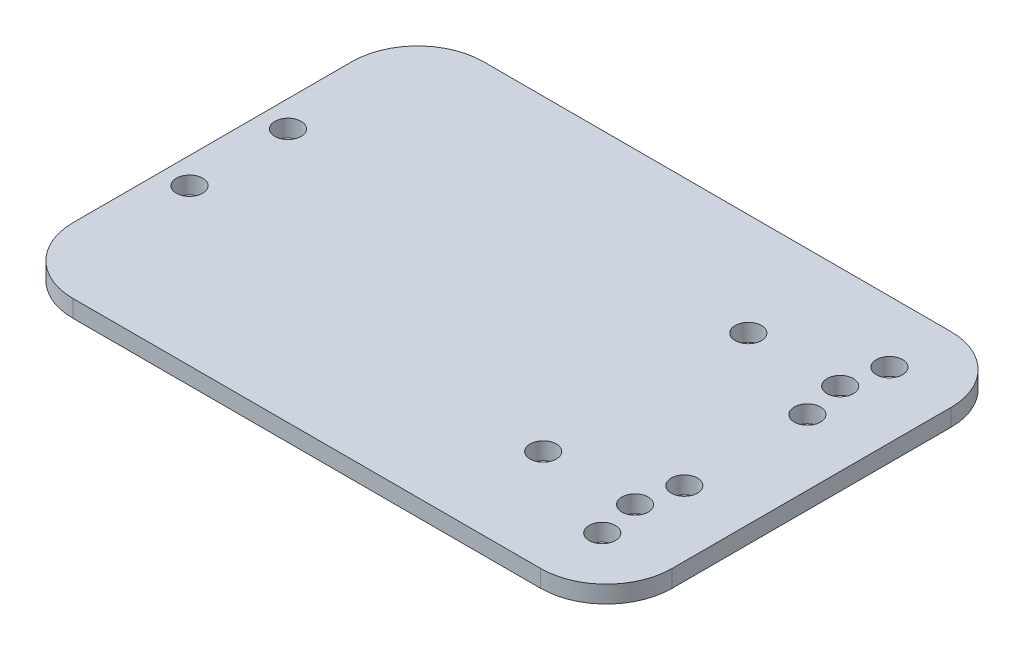
ISO-10303-21;
HEADER;
FILE_DESCRIPTION(('STEP AP214'),'2;1');
FILE_NAME('part.step','',(''),(''),'','','');
FILE_SCHEMA(('AUTOMOTIVE_DESIGN { 1 0 10303 214 1 1 1 1 }'));
ENDSEC;
DATA;
#1=APPLICATION_CONTEXT('core data for automotive mechanical design processes');
#2=APPLICATION_PROTOCOL_DEFINITION('international standard','automotive_design',2000,#1);
#3=PRODUCT_CONTEXT('',#1,'mechanical');
#4=PRODUCT('Part','Part','',(#3));
#5=PRODUCT_RELATED_PRODUCT_CATEGORY('part','',(#4));
#6=PRODUCT_DEFINITION_FORMATION('','',#4);
#7=PRODUCT_DEFINITION_CONTEXT('part definition',#1,'design');
#8=PRODUCT_DEFINITION('design','',#6,#7);
#9=PRODUCT_DEFINITION_SHAPE('','',#8);
#10=(LENGTH_UNIT() NAMED_UNIT(*) SI_UNIT(.MILLI.,.METRE.));
#11=(NAMED_UNIT(*) PLANE_ANGLE_UNIT() SI_UNIT($,.RADIAN.));
#12=(NAMED_UNIT(*) SI_UNIT($,.STERADIAN.) SOLID_ANGLE_UNIT());
#13=UNCERTAINTY_MEASURE_WITH_UNIT(LENGTH_MEASURE(1.E-05),#10,'distance_accuracy_value','');
#14=(GEOMETRIC_REPRESENTATION_CONTEXT(3) GLOBAL_UNCERTAINTY_ASSIGNED_CONTEXT((#13)) GLOBAL_UNIT_ASSIGNED_CONTEXT((#10,
#11,#12)) REPRESENTATION_CONTEXT('',''));
#15=CARTESIAN_POINT('',(0.,0.,0.));
#16=DIRECTION('',(0.,0.,1.));
#17=DIRECTION('',(1.,0.,0.));
#18=AXIS2_PLACEMENT_3D('',#15,#16,#17);
#19=CARTESIAN_POINT('',(36.5,2.1,25.));
#20=DIRECTION('',(-1.,0.,0.));
#21=DIRECTION('',(0.,0.,1.));
#22=AXIS2_PLACEMENT_3D('',#19,#20,#21);
#23=PLANE('',#22);
#24=DIRECTION('',(0.,0.,-1.));
#25=VECTOR('',#24,1.);
#26=CARTESIAN_POINT('',(36.5,0.,25.));
#27=LINE('',#26,#25);
#28=CARTESIAN_POINT('',(36.5,0.,17.));
#29=VERTEX_POINT('',#28);
#30=CARTESIAN_POINT('',(36.5,0.,-17.));
#31=VERTEX_POINT('',#30);
#32=EDGE_CURVE('E163',#29,#31,#27,.T.);
#33=ORIENTED_EDGE('',*,*,#32,.T.);
#34=DIRECTION('',(0.,-1.,0.));
#35=VECTOR('',#34,1.);
#36=CARTESIAN_POINT('',(36.5,2.1,-17.));
#37=LINE('',#36,#35);
#38=CARTESIAN_POINT('',(36.5,2.1,-17.));
#39=VERTEX_POINT('',#38);
#40=EDGE_CURVE('E11',#31,#39,#37,.F.);
#41=ORIENTED_EDGE('',*,*,#40,.T.);
#42=DIRECTION('',(0.,0.,-1.));
#43=VECTOR('',#42,1.);
#44=CARTESIAN_POINT('',(36.5,2.1,25.));
#45=LINE('',#44,#43);
#46=CARTESIAN_POINT('',(36.5,2.1,17.));
#47=VERTEX_POINT('',#46);
#48=EDGE_CURVE('E131',#47,#39,#45,.T.);
#49=ORIENTED_EDGE('',*,*,#48,.F.);
#50=DIRECTION('',(0.,-1.,0.));
#51=VECTOR('',#50,1.);
#52=CARTESIAN_POINT('',(36.5,2.1,17.));
#53=LINE('',#52,#51);
#54=EDGE_CURVE('E47',#47,#29,#53,.T.);
#55=ORIENTED_EDGE('',*,*,#54,.T.);
#56=EDGE_LOOP('',(#33,#41,#49,#55));
#57=FACE_BOUND('',#56,.T.);
#58=ADVANCED_FACE('F39',(#57),#23,.F.);
#59=CARTESIAN_POINT('',(-36.5,2.1,-25.));
#60=DIRECTION('',(0.,0.,1.));
#61=DIRECTION('',(1.,0.,0.));
#62=AXIS2_PLACEMENT_3D('',#59,#60,#61);
#63=PLANE('',#62);
#64=DIRECTION('',(-1.,0.,0.));
#65=VECTOR('',#64,1.);
#66=CARTESIAN_POINT('',(-36.5,0.,-25.));
#67=LINE('',#66,#65);
#68=CARTESIAN_POINT('',(28.5,0.,-25.));
#69=VERTEX_POINT('',#68);
#70=CARTESIAN_POINT('',(-28.5,0.,-25.));
#71=VERTEX_POINT('',#70);
#72=EDGE_CURVE('E136',#69,#71,#67,.T.);
#73=ORIENTED_EDGE('',*,*,#72,.T.);
#74=DIRECTION('',(0.,-1.,0.));
#75=VECTOR('',#74,1.);
#76=CARTESIAN_POINT('',(-28.5,2.1,-25.));
#77=LINE('',#76,#75);
#78=CARTESIAN_POINT('',(-28.5,2.1,-25.));
#79=VERTEX_POINT('',#78);
#80=EDGE_CURVE('E54',#71,#79,#77,.F.);
#81=ORIENTED_EDGE('',*,*,#80,.T.);
#82=DIRECTION('',(-1.,0.,0.));
#83=VECTOR('',#82,1.);
#84=CARTESIAN_POINT('',(-36.5,2.1,-25.));
#85=LINE('',#84,#83);
#86=CARTESIAN_POINT('',(28.5,2.1,-25.));
#87=VERTEX_POINT('',#86);
#88=EDGE_CURVE('E134',#87,#79,#85,.T.);
#89=ORIENTED_EDGE('',*,*,#88,.F.);
#90=DIRECTION('',(0.,-1.,0.));
#91=VECTOR('',#90,1.);
#92=CARTESIAN_POINT('',(28.5,2.1,-25.));
#93=LINE('',#92,#91);
#94=EDGE_CURVE('E155',#87,#69,#93,.T.);
#95=ORIENTED_EDGE('',*,*,#94,.T.);
#96=EDGE_LOOP('',(#73,#81,#89,#95));
#97=FACE_BOUND('',#96,.T.);
#98=ADVANCED_FACE('F271',(#97),#63,.F.);
#99=CARTESIAN_POINT('',(-36.5,2.1,25.));
#100=DIRECTION('',(1.,0.,0.));
#101=DIRECTION('',(0.,0.,-1.));
#102=AXIS2_PLACEMENT_3D('',#99,#100,#101);
#103=PLANE('',#102);
#104=DIRECTION('',(0.,0.,1.));
#105=VECTOR('',#104,1.);
#106=CARTESIAN_POINT('',(-36.5,0.,25.));
#107=LINE('',#106,#105);
#108=CARTESIAN_POINT('',(-36.5,0.,-17.));
#109=VERTEX_POINT('',#108);
#110=CARTESIAN_POINT('',(-36.5,0.,17.));
#111=VERTEX_POINT('',#110);
#112=EDGE_CURVE('E132',#109,#111,#107,.T.);
#113=ORIENTED_EDGE('',*,*,#112,.T.);
#114=DIRECTION('',(0.,-1.,0.));
#115=VECTOR('',#114,1.);
#116=CARTESIAN_POINT('',(-36.5,2.1,17.));
#117=LINE('',#116,#115);
#118=CARTESIAN_POINT('',(-36.5,2.1,17.));
#119=VERTEX_POINT('',#118);
#120=EDGE_CURVE('E110',#111,#119,#117,.F.);
#121=ORIENTED_EDGE('',*,*,#120,.T.);
#122=DIRECTION('',(0.,0.,1.));
#123=VECTOR('',#122,1.);
#124=CARTESIAN_POINT('',(-36.5,2.1,25.));
#125=LINE('',#124,#123);
#126=CARTESIAN_POINT('',(-36.5,2.1,-17.));
#127=VERTEX_POINT('',#126);
#128=EDGE_CURVE('E175',#127,#119,#125,.T.);
#129=ORIENTED_EDGE('',*,*,#128,.F.);
#130=DIRECTION('',(0.,-1.,0.));
#131=VECTOR('',#130,1.);
#132=CARTESIAN_POINT('',(-36.5,2.1,-17.));
#133=LINE('',#132,#131);
#134=EDGE_CURVE('E115',#127,#109,#133,.T.);
#135=ORIENTED_EDGE('',*,*,#134,.T.);
#136=EDGE_LOOP('',(#113,#121,#129,#135));
#137=FACE_BOUND('',#136,.T.);
#138=ADVANCED_FACE('F268',(#137),#103,.F.);
#139=CARTESIAN_POINT('',(-36.5,2.1,25.));
#140=DIRECTION('',(0.,0.,-1.));
#141=DIRECTION('',(-1.,0.,0.));
#142=AXIS2_PLACEMENT_3D('',#139,#140,#141);
#143=PLANE('',#142);
#144=DIRECTION('',(1.,0.,0.));
#145=VECTOR('',#144,1.);
#146=CARTESIAN_POINT('',(-36.5,2.1,25.));
#147=LINE('',#146,#145);
#148=CARTESIAN_POINT('',(-28.5,2.1,25.));
#149=VERTEX_POINT('',#148);
#150=CARTESIAN_POINT('',(28.5,2.1,25.));
#151=VERTEX_POINT('',#150);
#152=EDGE_CURVE('E125',#149,#151,#147,.T.);
#153=ORIENTED_EDGE('',*,*,#152,.F.);
#154=DIRECTION('',(0.,-1.,0.));
#155=VECTOR('',#154,1.);
#156=CARTESIAN_POINT('',(-28.5,2.1,25.));
#157=LINE('',#156,#155);
#158=CARTESIAN_POINT('',(-28.5,0.,25.));
#159=VERTEX_POINT('',#158);
#160=EDGE_CURVE('E109',#149,#159,#157,.T.);
#161=ORIENTED_EDGE('',*,*,#160,.T.);
#162=DIRECTION('',(1.,0.,0.));
#163=VECTOR('',#162,1.);
#164=CARTESIAN_POINT('',(-36.5,0.,25.));
#165=LINE('',#164,#163);
#166=CARTESIAN_POINT('',(28.5,0.,25.));
#167=VERTEX_POINT('',#166);
#168=EDGE_CURVE('E122',#159,#167,#165,.T.);
#169=ORIENTED_EDGE('',*,*,#168,.T.);
#170=DIRECTION('',(0.,-1.,0.));
#171=VECTOR('',#170,1.);
#172=CARTESIAN_POINT('',(28.5,2.1,25.));
#173=LINE('',#172,#171);
#174=EDGE_CURVE('E127',#167,#151,#173,.F.);
#175=ORIENTED_EDGE('',*,*,#174,.T.);
#176=EDGE_LOOP('',(#153,#161,#169,#175));
#177=FACE_BOUND('',#176,.T.);
#178=ADVANCED_FACE('F121',(#177),#143,.F.);
#179=CARTESIAN_POINT('',(0.,2.1,0.));
#180=DIRECTION('',(0.,-1.,0.));
#181=DIRECTION('',(0.,0.,-1.));
#182=AXIS2_PLACEMENT_3D('',#179,#180,#181);
#183=PLANE('',#182);
#184=CARTESIAN_POINT('',(16.3,2.1,-12.5));
#185=DIRECTION('',(0.,1.,0.));
#186=DIRECTION('',(0.,0.,1.));
#187=AXIS2_PLACEMENT_3D('',#184,#185,#186);
#188=CIRCLE('',#187,1.6);
#189=CARTESIAN_POINT('',(16.3,2.1,-10.9));
#190=VERTEX_POINT('',#189);
#191=EDGE_CURVE('E225',#190,#190,#188,.T.);
#192=ORIENTED_EDGE('',*,*,#191,.F.);
#193=EDGE_LOOP('',(#192));
#194=FACE_BOUND('',#193,.T.);
#195=CARTESIAN_POINT('',(27.5,2.1,12.5));
#196=DIRECTION('',(0.,1.,0.));
#197=DIRECTION('',(0.,0.,1.));
#198=AXIS2_PLACEMENT_3D('',#195,#196,#197);
#199=CIRCLE('',#198,1.6);
#200=CARTESIAN_POINT('',(27.5,2.1,14.1));
#201=VERTEX_POINT('',#200);
#202=EDGE_CURVE('E218',#201,#201,#199,.T.);
#203=ORIENTED_EDGE('',*,*,#202,.F.);
#204=EDGE_LOOP('',(#203));
#205=FACE_BOUND('',#204,.T.);
#206=CARTESIAN_POINT('',(16.3,2.1,12.5));
#207=DIRECTION('',(0.,1.,0.));
#208=DIRECTION('',(0.,0.,1.));
#209=AXIS2_PLACEMENT_3D('',#206,#207,#208);
#210=CIRCLE('',#209,1.6);
#211=CARTESIAN_POINT('',(16.3,2.1,14.1));
#212=VERTEX_POINT('',#211);
#213=EDGE_CURVE('E230',#212,#212,#210,.T.);
#214=ORIENTED_EDGE('',*,*,#213,.F.);
#215=EDGE_LOOP('',(#214));
#216=FACE_BOUND('',#215,.T.);
#217=CARTESIAN_POINT('',(27.5,2.1,-12.5));
#218=DIRECTION('',(0.,1.,0.));
#219=DIRECTION('',(0.,0.,1.));
#220=AXIS2_PLACEMENT_3D('',#217,#218,#219);
#221=CIRCLE('',#220,1.6);
#222=CARTESIAN_POINT('',(27.5,2.1,-10.9));
#223=VERTEX_POINT('',#222);
#224=EDGE_CURVE('E212',#223,#223,#221,.T.);
#225=ORIENTED_EDGE('',*,*,#224,.F.);
#226=EDGE_LOOP('',(#225));
#227=FACE_BOUND('',#226,.T.);
#228=CARTESIAN_POINT('',(28.5,2.1,-17.5));
#229=DIRECTION('',(0.,1.,0.));
#230=DIRECTION('',(0.,0.,1.));
#231=AXIS2_PLACEMENT_3D('',#228,#229,#230);
#232=CIRCLE('',#231,1.6);
#233=CARTESIAN_POINT('',(28.5,2.1,-15.9));
#234=VERTEX_POINT('',#233);
#235=EDGE_CURVE('E207',#234,#234,#232,.T.);
#236=ORIENTED_EDGE('',*,*,#235,.F.);
#237=EDGE_LOOP('',(#236));
#238=FACE_BOUND('',#237,.T.);
#239=CARTESIAN_POINT('',(28.5,2.1,7.5));
#240=DIRECTION('',(0.,1.,0.));
#241=DIRECTION('',(0.,0.,1.));
#242=AXIS2_PLACEMENT_3D('',#239,#240,#241);
#243=CIRCLE('',#242,1.6);
#244=CARTESIAN_POINT('',(28.5,2.1,9.1));
#245=VERTEX_POINT('',#244);
#246=EDGE_CURVE('E204',#245,#245,#243,.T.);
#247=ORIENTED_EDGE('',*,*,#246,.F.);
#248=EDGE_LOOP('',(#247));
#249=FACE_BOUND('',#248,.T.);
#250=CARTESIAN_POINT('',(28.5,2.1,17.5));
#251=DIRECTION('',(0.,1.,0.));
#252=DIRECTION('',(0.,0.,1.));
#253=AXIS2_PLACEMENT_3D('',#250,#251,#252);
#254=CIRCLE('',#253,1.6);
#255=CARTESIAN_POINT('',(28.5,2.1,19.1));
#256=VERTEX_POINT('',#255);
#257=EDGE_CURVE('E198',#256,#256,#254,.T.);
#258=ORIENTED_EDGE('',*,*,#257,.F.);
#259=EDGE_LOOP('',(#258));
#260=FACE_BOUND('',#259,.T.);
#261=CARTESIAN_POINT('',(28.5,2.1,-7.5));
#262=DIRECTION('',(0.,1.,0.));
#263=DIRECTION('',(0.,0.,1.));
#264=AXIS2_PLACEMENT_3D('',#261,#262,#263);
#265=CIRCLE('',#264,1.6);
#266=CARTESIAN_POINT('',(28.5,2.1,-5.9));
#267=VERTEX_POINT('',#266);
#268=EDGE_CURVE('E191',#267,#267,#265,.T.);
#269=ORIENTED_EDGE('',*,*,#268,.F.);
#270=EDGE_LOOP('',(#269));
#271=FACE_BOUND('',#270,.T.);
#272=CARTESIAN_POINT('',(-33.3,2.1,-6.));
#273=DIRECTION('',(0.,1.,0.));
#274=DIRECTION('',(0.,0.,1.));
#275=AXIS2_PLACEMENT_3D('',#272,#273,#274);
#276=CIRCLE('',#275,1.6);
#277=CARTESIAN_POINT('',(-33.3,2.1,-4.4));
#278=VERTEX_POINT('',#277);
#279=EDGE_CURVE('E171',#278,#278,#276,.T.);
#280=ORIENTED_EDGE('',*,*,#279,.F.);
#281=EDGE_LOOP('',(#280));
#282=FACE_BOUND('',#281,.T.);
#283=CARTESIAN_POINT('',(-33.3,2.1,6.));
#284=DIRECTION('',(0.,1.,0.));
#285=DIRECTION('',(0.,0.,1.));
#286=AXIS2_PLACEMENT_3D('',#283,#284,#285);
#287=CIRCLE('',#286,1.6);
#288=CARTESIAN_POINT('',(-33.3,2.1,7.6));
#289=VERTEX_POINT('',#288);
#290=EDGE_CURVE('E179',#289,#289,#287,.T.);
#291=ORIENTED_EDGE('',*,*,#290,.F.);
#292=EDGE_LOOP('',(#291));
#293=FACE_BOUND('',#292,.T.);
#294=ORIENTED_EDGE('',*,*,#128,.T.);
#295=CARTESIAN_POINT('',(-28.5,2.1,17.));
#296=DIRECTION('',(0.,-1.,0.));
#297=DIRECTION('',(0.,0.,-1.));
#298=AXIS2_PLACEMENT_3D('',#295,#296,#297);
#299=CIRCLE('',#298,8.);
#300=EDGE_CURVE('E153',#119,#149,#299,.F.);
#301=ORIENTED_EDGE('',*,*,#300,.T.);
#302=ORIENTED_EDGE('',*,*,#152,.T.);
#303=CARTESIAN_POINT('',(28.5,2.1,17.));
#304=DIRECTION('',(0.,-1.,0.));
#305=DIRECTION('',(0.,0.,-1.));
#306=AXIS2_PLACEMENT_3D('',#303,#304,#305);
#307=CIRCLE('',#306,8.);
#308=EDGE_CURVE('E148',#151,#47,#307,.F.);
#309=ORIENTED_EDGE('',*,*,#308,.T.);
#310=ORIENTED_EDGE('',*,*,#48,.T.);
#311=CARTESIAN_POINT('',(28.5,2.1,-17.));
#312=DIRECTION('',(0.,-1.,0.));
#313=DIRECTION('',(0.,0.,-1.));
#314=AXIS2_PLACEMENT_3D('',#311,#312,#313);
#315=CIRCLE('',#314,8.);
#316=EDGE_CURVE('E61',#39,#87,#315,.F.);
#317=ORIENTED_EDGE('',*,*,#316,.T.);
#318=ORIENTED_EDGE('',*,*,#88,.T.);
#319=CARTESIAN_POINT('',(-28.5,2.1,-17.));
#320=DIRECTION('',(0.,-1.,0.));
#321=DIRECTION('',(0.,0.,-1.));
#322=AXIS2_PLACEMENT_3D('',#319,#320,#321);
#323=CIRCLE('',#322,8.);
#324=EDGE_CURVE('E151',#79,#127,#323,.F.);
#325=ORIENTED_EDGE('',*,*,#324,.T.);
#326=EDGE_LOOP('',(#294,#301,#302,#309,#310,#317,#318,#325));
#327=FACE_BOUND('',#326,.T.);
#328=ADVANCED_FACE('F246',(#194,#205,#216,#227,#238,#249,#260,#271,#282,#293,#327),#183,.F.);
#329=CARTESIAN_POINT('',(0.,0.,0.));
#330=DIRECTION('',(0.,-1.,0.));
#331=DIRECTION('',(0.,0.,-1.));
#332=AXIS2_PLACEMENT_3D('',#329,#330,#331);
#333=PLANE('',#332);
#334=CARTESIAN_POINT('',(16.3,0.,-12.5));
#335=DIRECTION('',(0.,1.,0.));
#336=DIRECTION('',(0.,0.,1.));
#337=AXIS2_PLACEMENT_3D('',#334,#335,#336);
#338=CIRCLE('',#337,1.6);
#339=CARTESIAN_POINT('',(16.3,0.,-10.9));
#340=VERTEX_POINT('',#339);
#341=EDGE_CURVE('E215',#340,#340,#338,.T.);
#342=ORIENTED_EDGE('',*,*,#341,.T.);
#343=EDGE_LOOP('',(#342));
#344=FACE_BOUND('',#343,.T.);
#345=CARTESIAN_POINT('',(27.5,0.,12.5));
#346=DIRECTION('',(0.,1.,0.));
#347=DIRECTION('',(0.,0.,1.));
#348=AXIS2_PLACEMENT_3D('',#345,#346,#347);
#349=CIRCLE('',#348,1.6);
#350=CARTESIAN_POINT('',(27.5,0.,14.1));
#351=VERTEX_POINT('',#350);
#352=EDGE_CURVE('E221',#351,#351,#349,.T.);
#353=ORIENTED_EDGE('',*,*,#352,.T.);
#354=EDGE_LOOP('',(#353));
#355=FACE_BOUND('',#354,.T.);
#356=CARTESIAN_POINT('',(16.3,0.,12.5));
#357=DIRECTION('',(0.,1.,0.));
#358=DIRECTION('',(0.,0.,1.));
#359=AXIS2_PLACEMENT_3D('',#356,#357,#358);
#360=CIRCLE('',#359,1.6);
#361=CARTESIAN_POINT('',(16.3,0.,14.1));
#362=VERTEX_POINT('',#361);
#363=EDGE_CURVE('E222',#362,#362,#360,.T.);
#364=ORIENTED_EDGE('',*,*,#363,.T.);
#365=EDGE_LOOP('',(#364));
#366=FACE_BOUND('',#365,.T.);
#367=CARTESIAN_POINT('',(27.5,0.,-12.5));
#368=DIRECTION('',(0.,1.,0.));
#369=DIRECTION('',(0.,0.,1.));
#370=AXIS2_PLACEMENT_3D('',#367,#368,#369);
#371=CIRCLE('',#370,1.6);
#372=CARTESIAN_POINT('',(27.5,0.,-10.9));
#373=VERTEX_POINT('',#372);
#374=EDGE_CURVE('E192',#373,#373,#371,.T.);
#375=ORIENTED_EDGE('',*,*,#374,.T.);
#376=EDGE_LOOP('',(#375));
#377=FACE_BOUND('',#376,.T.);
#378=CARTESIAN_POINT('',(28.5,0.,-17.5));
#379=DIRECTION('',(0.,1.,0.));
#380=DIRECTION('',(0.,0.,1.));
#381=AXIS2_PLACEMENT_3D('',#378,#379,#380);
#382=CIRCLE('',#381,1.6);
#383=CARTESIAN_POINT('',(28.5,0.,-15.9));
#384=VERTEX_POINT('',#383);
#385=EDGE_CURVE('E183',#384,#384,#382,.T.);
#386=ORIENTED_EDGE('',*,*,#385,.T.);
#387=EDGE_LOOP('',(#386));
#388=FACE_BOUND('',#387,.T.);
#389=CARTESIAN_POINT('',(28.5,0.,7.5));
#390=DIRECTION('',(0.,1.,0.));
#391=DIRECTION('',(0.,0.,1.));
#392=AXIS2_PLACEMENT_3D('',#389,#390,#391);
#393=CIRCLE('',#392,1.6);
#394=CARTESIAN_POINT('',(28.5,0.,9.1));
#395=VERTEX_POINT('',#394);
#396=EDGE_CURVE('E201',#395,#395,#393,.T.);
#397=ORIENTED_EDGE('',*,*,#396,.T.);
#398=EDGE_LOOP('',(#397));
#399=FACE_BOUND('',#398,.T.);
#400=CARTESIAN_POINT('',(28.5,0.,17.5));
#401=DIRECTION('',(0.,1.,0.));
#402=DIRECTION('',(0.,0.,1.));
#403=AXIS2_PLACEMENT_3D('',#400,#401,#402);
#404=CIRCLE('',#403,1.6);
#405=CARTESIAN_POINT('',(28.5,0.,19.1));
#406=VERTEX_POINT('',#405);
#407=EDGE_CURVE('E195',#406,#406,#404,.T.);
#408=ORIENTED_EDGE('',*,*,#407,.T.);
#409=EDGE_LOOP('',(#408));
#410=FACE_BOUND('',#409,.T.);
#411=CARTESIAN_POINT('',(28.5,0.,-7.5));
#412=DIRECTION('',(0.,1.,0.));
#413=DIRECTION('',(0.,0.,1.));
#414=AXIS2_PLACEMENT_3D('',#411,#412,#413);
#415=CIRCLE('',#414,1.6);
#416=CARTESIAN_POINT('',(28.5,0.,-5.9));
#417=VERTEX_POINT('',#416);
#418=EDGE_CURVE('E188',#417,#417,#415,.T.);
#419=ORIENTED_EDGE('',*,*,#418,.T.);
#420=EDGE_LOOP('',(#419));
#421=FACE_BOUND('',#420,.T.);
#422=CARTESIAN_POINT('',(-33.3,0.,-6.));
#423=DIRECTION('',(0.,1.,0.));
#424=DIRECTION('',(0.,0.,1.));
#425=AXIS2_PLACEMENT_3D('',#422,#423,#424);
#426=CIRCLE('',#425,1.6);
#427=CARTESIAN_POINT('',(-33.3,0.,-4.4));
#428=VERTEX_POINT('',#427);
#429=EDGE_CURVE('E168',#428,#428,#426,.T.);
#430=ORIENTED_EDGE('',*,*,#429,.T.);
#431=EDGE_LOOP('',(#430));
#432=FACE_BOUND('',#431,.T.);
#433=CARTESIAN_POINT('',(-33.3,0.,6.));
#434=DIRECTION('',(0.,1.,0.));
#435=DIRECTION('',(0.,0.,1.));
#436=AXIS2_PLACEMENT_3D('',#433,#434,#435);
#437=CIRCLE('',#436,1.6);
#438=CARTESIAN_POINT('',(-33.3,0.,7.6));
#439=VERTEX_POINT('',#438);
#440=EDGE_CURVE('E182',#439,#439,#437,.T.);
#441=ORIENTED_EDGE('',*,*,#440,.T.);
#442=EDGE_LOOP('',(#441));
#443=FACE_BOUND('',#442,.T.);
#444=ORIENTED_EDGE('',*,*,#168,.F.);
#445=CARTESIAN_POINT('',(-28.5,0.,17.));
#446=DIRECTION('',(0.,-1.,0.));
#447=DIRECTION('',(0.,0.,-1.));
#448=AXIS2_PLACEMENT_3D('',#445,#446,#447);
#449=CIRCLE('',#448,8.);
#450=EDGE_CURVE('E105',#159,#111,#449,.T.);
#451=ORIENTED_EDGE('',*,*,#450,.T.);
#452=ORIENTED_EDGE('',*,*,#112,.F.);
#453=CARTESIAN_POINT('',(-28.5,0.,-17.));
#454=DIRECTION('',(0.,-1.,0.));
#455=DIRECTION('',(0.,0.,-1.));
#456=AXIS2_PLACEMENT_3D('',#453,#454,#455);
#457=CIRCLE('',#456,8.);
#458=EDGE_CURVE('E116',#109,#71,#457,.T.);
#459=ORIENTED_EDGE('',*,*,#458,.T.);
#460=ORIENTED_EDGE('',*,*,#72,.F.);
#461=CARTESIAN_POINT('',(28.5,0.,-17.));
#462=DIRECTION('',(0.,-1.,0.));
#463=DIRECTION('',(0.,0.,-1.));
#464=AXIS2_PLACEMENT_3D('',#461,#462,#463);
#465=CIRCLE('',#464,8.);
#466=EDGE_CURVE('E142',#69,#31,#465,.T.);
#467=ORIENTED_EDGE('',*,*,#466,.T.);
#468=ORIENTED_EDGE('',*,*,#32,.F.);
#469=CARTESIAN_POINT('',(28.5,0.,17.));
#470=DIRECTION('',(0.,-1.,0.));
#471=DIRECTION('',(0.,0.,-1.));
#472=AXIS2_PLACEMENT_3D('',#469,#470,#471);
#473=CIRCLE('',#472,8.);
#474=EDGE_CURVE('E126',#29,#167,#473,.T.);
#475=ORIENTED_EDGE('',*,*,#474,.T.);
#476=EDGE_LOOP('',(#444,#451,#452,#459,#460,#467,#468,#475));
#477=FACE_BOUND('',#476,.T.);
#478=ADVANCED_FACE('F129',(#344,#355,#366,#377,#388,#399,#410,#421,#432,#443,#477),#333,.T.);
#479=CARTESIAN_POINT('',(-33.3,0.,6.));
#480=DIRECTION('',(0.,1.,0.));
#481=DIRECTION('',(0.,0.,1.));
#482=AXIS2_PLACEMENT_3D('',#479,#480,#481);
#483=CYLINDRICAL_SURFACE('',#482,1.6);
#484=ORIENTED_EDGE('',*,*,#440,.F.);
#485=EDGE_LOOP('',(#484));
#486=FACE_BOUND('',#485,.T.);
#487=ORIENTED_EDGE('',*,*,#290,.T.);
#488=EDGE_LOOP('',(#487));
#489=FACE_BOUND('',#488,.T.);
#490=ADVANCED_FACE('F399',(#486,#489),#483,.F.);
#491=CARTESIAN_POINT('',(-33.3,0.,-6.));
#492=DIRECTION('',(0.,1.,0.));
#493=DIRECTION('',(0.,0.,1.));
#494=AXIS2_PLACEMENT_3D('',#491,#492,#493);
#495=CYLINDRICAL_SURFACE('',#494,1.6);
#496=ORIENTED_EDGE('',*,*,#429,.F.);
#497=EDGE_LOOP('',(#496));
#498=FACE_BOUND('',#497,.T.);
#499=ORIENTED_EDGE('',*,*,#279,.T.);
#500=EDGE_LOOP('',(#499));
#501=FACE_BOUND('',#500,.T.);
#502=ADVANCED_FACE('F389',(#498,#501),#495,.F.);
#503=CARTESIAN_POINT('',(28.5,0.,-7.5));
#504=DIRECTION('',(0.,1.,0.));
#505=DIRECTION('',(0.,0.,1.));
#506=AXIS2_PLACEMENT_3D('',#503,#504,#505);
#507=CYLINDRICAL_SURFACE('',#506,1.6);
#508=ORIENTED_EDGE('',*,*,#418,.F.);
#509=EDGE_LOOP('',(#508));
#510=FACE_BOUND('',#509,.T.);
#511=ORIENTED_EDGE('',*,*,#268,.T.);
#512=EDGE_LOOP('',(#511));
#513=FACE_BOUND('',#512,.T.);
#514=ADVANCED_FACE('F379',(#510,#513),#507,.F.);
#515=CARTESIAN_POINT('',(28.5,0.,17.5));
#516=DIRECTION('',(0.,1.,0.));
#517=DIRECTION('',(0.,0.,1.));
#518=AXIS2_PLACEMENT_3D('',#515,#516,#517);
#519=CYLINDRICAL_SURFACE('',#518,1.6);
#520=ORIENTED_EDGE('',*,*,#407,.F.);
#521=EDGE_LOOP('',(#520));
#522=FACE_BOUND('',#521,.T.);
#523=ORIENTED_EDGE('',*,*,#257,.T.);
#524=EDGE_LOOP('',(#523));
#525=FACE_BOUND('',#524,.T.);
#526=ADVANCED_FACE('F369',(#522,#525),#519,.F.);
#527=CARTESIAN_POINT('',(28.5,0.,7.5));
#528=DIRECTION('',(0.,1.,0.));
#529=DIRECTION('',(0.,0.,1.));
#530=AXIS2_PLACEMENT_3D('',#527,#528,#529);
#531=CYLINDRICAL_SURFACE('',#530,1.6);
#532=ORIENTED_EDGE('',*,*,#396,.F.);
#533=EDGE_LOOP('',(#532));
#534=FACE_BOUND('',#533,.T.);
#535=ORIENTED_EDGE('',*,*,#246,.T.);
#536=EDGE_LOOP('',(#535));
#537=FACE_BOUND('',#536,.T.);
#538=ADVANCED_FACE('F359',(#534,#537),#531,.F.);
#539=CARTESIAN_POINT('',(28.5,0.,-17.5));
#540=DIRECTION('',(0.,1.,0.));
#541=DIRECTION('',(0.,0.,1.));
#542=AXIS2_PLACEMENT_3D('',#539,#540,#541);
#543=CYLINDRICAL_SURFACE('',#542,1.6);
#544=ORIENTED_EDGE('',*,*,#385,.F.);
#545=EDGE_LOOP('',(#544));
#546=FACE_BOUND('',#545,.T.);
#547=ORIENTED_EDGE('',*,*,#235,.T.);
#548=EDGE_LOOP('',(#547));
#549=FACE_BOUND('',#548,.T.);
#550=ADVANCED_FACE('F349',(#546,#549),#543,.F.);
#551=CARTESIAN_POINT('',(27.5,0.,-12.5));
#552=DIRECTION('',(0.,1.,0.));
#553=DIRECTION('',(0.,0.,1.));
#554=AXIS2_PLACEMENT_3D('',#551,#552,#553);
#555=CYLINDRICAL_SURFACE('',#554,1.6);
#556=ORIENTED_EDGE('',*,*,#374,.F.);
#557=EDGE_LOOP('',(#556));
#558=FACE_BOUND('',#557,.T.);
#559=ORIENTED_EDGE('',*,*,#224,.T.);
#560=EDGE_LOOP('',(#559));
#561=FACE_BOUND('',#560,.T.);
#562=ADVANCED_FACE('F242',(#558,#561),#555,.F.);
#563=CARTESIAN_POINT('',(16.3,0.,12.5));
#564=DIRECTION('',(0.,1.,0.));
#565=DIRECTION('',(0.,0.,1.));
#566=AXIS2_PLACEMENT_3D('',#563,#564,#565);
#567=CYLINDRICAL_SURFACE('',#566,1.6);
#568=ORIENTED_EDGE('',*,*,#363,.F.);
#569=EDGE_LOOP('',(#568));
#570=FACE_BOUND('',#569,.T.);
#571=ORIENTED_EDGE('',*,*,#213,.T.);
#572=EDGE_LOOP('',(#571));
#573=FACE_BOUND('',#572,.T.);
#574=ADVANCED_FACE('F238',(#570,#573),#567,.F.);
#575=CARTESIAN_POINT('',(27.5,0.,12.5));
#576=DIRECTION('',(0.,1.,0.));
#577=DIRECTION('',(0.,0.,1.));
#578=AXIS2_PLACEMENT_3D('',#575,#576,#577);
#579=CYLINDRICAL_SURFACE('',#578,1.6);
#580=ORIENTED_EDGE('',*,*,#352,.F.);
#581=EDGE_LOOP('',(#580));
#582=FACE_BOUND('',#581,.T.);
#583=ORIENTED_EDGE('',*,*,#202,.T.);
#584=EDGE_LOOP('',(#583));
#585=FACE_BOUND('',#584,.T.);
#586=ADVANCED_FACE('F241',(#582,#585),#579,.F.);
#587=CARTESIAN_POINT('',(16.3,0.,-12.5));
#588=DIRECTION('',(0.,1.,0.));
#589=DIRECTION('',(0.,0.,1.));
#590=AXIS2_PLACEMENT_3D('',#587,#588,#589);
#591=CYLINDRICAL_SURFACE('',#590,1.6);
#592=ORIENTED_EDGE('',*,*,#341,.F.);
#593=EDGE_LOOP('',(#592));
#594=FACE_BOUND('',#593,.T.);
#595=ORIENTED_EDGE('',*,*,#191,.T.);
#596=EDGE_LOOP('',(#595));
#597=FACE_BOUND('',#596,.T.);
#598=ADVANCED_FACE('F289',(#594,#597),#591,.F.);
#599=CARTESIAN_POINT('',(-28.5,2.1,17.));
#600=DIRECTION('',(0.,-1.,0.));
#601=DIRECTION('',(0.,0.,-1.));
#602=AXIS2_PLACEMENT_3D('',#599,#600,#601);
#603=CYLINDRICAL_SURFACE('',#602,8.);
#604=ORIENTED_EDGE('',*,*,#300,.F.);
#605=ORIENTED_EDGE('',*,*,#120,.F.);
#606=ORIENTED_EDGE('',*,*,#450,.F.);
#607=ORIENTED_EDGE('',*,*,#160,.F.);
#608=EDGE_LOOP('',(#604,#605,#606,#607));
#609=FACE_BOUND('',#608,.T.);
#610=ADVANCED_FACE('F108',(#609),#603,.T.);
#611=CARTESIAN_POINT('',(-28.5,2.1,-17.));
#612=DIRECTION('',(0.,-1.,0.));
#613=DIRECTION('',(0.,0.,-1.));
#614=AXIS2_PLACEMENT_3D('',#611,#612,#613);
#615=CYLINDRICAL_SURFACE('',#614,8.);
#616=ORIENTED_EDGE('',*,*,#324,.F.);
#617=ORIENTED_EDGE('',*,*,#80,.F.);
#618=ORIENTED_EDGE('',*,*,#458,.F.);
#619=ORIENTED_EDGE('',*,*,#134,.F.);
#620=EDGE_LOOP('',(#616,#617,#618,#619));
#621=FACE_BOUND('',#620,.T.);
#622=ADVANCED_FACE('F270',(#621),#615,.T.);
#623=CARTESIAN_POINT('',(28.5,2.1,-17.));
#624=DIRECTION('',(0.,-1.,0.));
#625=DIRECTION('',(0.,0.,-1.));
#626=AXIS2_PLACEMENT_3D('',#623,#624,#625);
#627=CYLINDRICAL_SURFACE('',#626,8.);
#628=ORIENTED_EDGE('',*,*,#316,.F.);
#629=ORIENTED_EDGE('',*,*,#40,.F.);
#630=ORIENTED_EDGE('',*,*,#466,.F.);
#631=ORIENTED_EDGE('',*,*,#94,.F.);
#632=EDGE_LOOP('',(#628,#629,#630,#631));
#633=FACE_BOUND('',#632,.T.);
#634=ADVANCED_FACE('F274',(#633),#627,.T.);
#635=CARTESIAN_POINT('',(28.5,2.1,17.));
#636=DIRECTION('',(0.,-1.,0.));
#637=DIRECTION('',(0.,0.,-1.));
#638=AXIS2_PLACEMENT_3D('',#635,#636,#637);
#639=CYLINDRICAL_SURFACE('',#638,8.);
#640=ORIENTED_EDGE('',*,*,#308,.F.);
#641=ORIENTED_EDGE('',*,*,#174,.F.);
#642=ORIENTED_EDGE('',*,*,#474,.F.);
#643=ORIENTED_EDGE('',*,*,#54,.F.);
#644=EDGE_LOOP('',(#640,#641,#642,#643));
#645=FACE_BOUND('',#644,.T.);
#646=ADVANCED_FACE('F41',(#645),#639,.T.);
#647=CLOSED_SHELL('',(#58,#98,#138,#178,#328,#478,#490,#502,#514,#526,#538,#550,#562,#574,#586,
#598,#610,#622,#634,#646));
#648=MANIFOLD_SOLID_BREP('B2',#647);
#649=ADVANCED_BREP_SHAPE_REPRESENTATION('',(#18,#648),#14);
#650=SHAPE_DEFINITION_REPRESENTATION(#9,#649);
ENDSEC;
END-ISO-10303-21;
